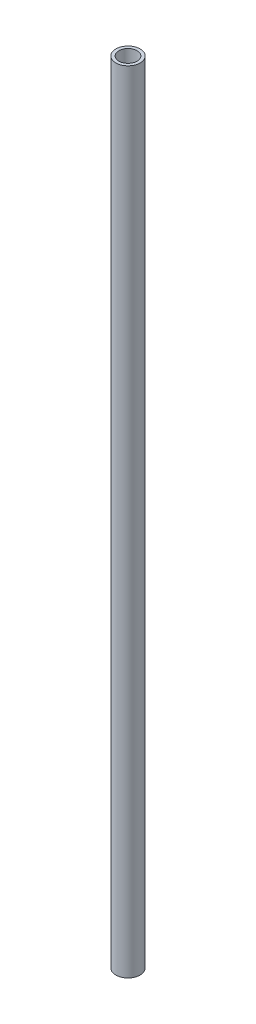
ISO-10303-21;
HEADER;
FILE_DESCRIPTION(('STEP AP214'),'2;1');
FILE_NAME('part.step','',(''),(''),'','','');
FILE_SCHEMA(('AUTOMOTIVE_DESIGN { 1 0 10303 214 1 1 1 1 }'));
ENDSEC;
DATA;
#1=APPLICATION_CONTEXT('core data for automotive mechanical design processes');
#2=APPLICATION_PROTOCOL_DEFINITION('international standard','automotive_design',2000,#1);
#3=PRODUCT_CONTEXT('',#1,'mechanical');
#4=PRODUCT('Part','Part','',(#3));
#5=PRODUCT_RELATED_PRODUCT_CATEGORY('part','',(#4));
#6=PRODUCT_DEFINITION_FORMATION('','',#4);
#7=PRODUCT_DEFINITION_CONTEXT('part definition',#1,'design');
#8=PRODUCT_DEFINITION('design','',#6,#7);
#9=PRODUCT_DEFINITION_SHAPE('','',#8);
#10=(LENGTH_UNIT() NAMED_UNIT(*) SI_UNIT(.MILLI.,.METRE.));
#11=(NAMED_UNIT(*) PLANE_ANGLE_UNIT() SI_UNIT($,.RADIAN.));
#12=(NAMED_UNIT(*) SI_UNIT($,.STERADIAN.) SOLID_ANGLE_UNIT());
#13=UNCERTAINTY_MEASURE_WITH_UNIT(LENGTH_MEASURE(1.E-05),#10,'distance_accuracy_value','');
#14=(GEOMETRIC_REPRESENTATION_CONTEXT(3) GLOBAL_UNCERTAINTY_ASSIGNED_CONTEXT((#13)) GLOBAL_UNIT_ASSIGNED_CONTEXT((#10,
#11,#12)) REPRESENTATION_CONTEXT('',''));
#15=CARTESIAN_POINT('',(0.,0.,0.));
#16=DIRECTION('',(0.,0.,1.));
#17=DIRECTION('',(1.,0.,0.));
#18=AXIS2_PLACEMENT_3D('',#15,#16,#17);
#19=CARTESIAN_POINT('',(0.,130.,0.));
#20=DIRECTION('',(0.,1.,0.));
#21=DIRECTION('',(0.,0.,1.));
#22=AXIS2_PLACEMENT_3D('',#19,#20,#21);
#23=PLANE('',#22);
#24=CARTESIAN_POINT('',(0.,130.,0.));
#25=DIRECTION('',(0.,1.,0.));
#26=DIRECTION('',(0.,0.,1.));
#27=AXIS2_PLACEMENT_3D('',#24,#25,#26);
#28=CIRCLE('',#27,4.);
#29=CARTESIAN_POINT('',(0.,130.,4.));
#30=VERTEX_POINT('',#29);
#31=EDGE_CURVE('E10',#30,#30,#28,.T.);
#32=ORIENTED_EDGE('',*,*,#31,.T.);
#33=EDGE_LOOP('',(#32));
#34=FACE_BOUND('',#33,.T.);
#35=CARTESIAN_POINT('',(0.,130.,0.));
#36=DIRECTION('',(0.,1.,0.));
#37=DIRECTION('',(0.,0.,1.));
#38=AXIS2_PLACEMENT_3D('',#35,#36,#37);
#39=CIRCLE('',#38,3.);
#40=CARTESIAN_POINT('',(0.,130.,3.));
#41=VERTEX_POINT('',#40);
#42=EDGE_CURVE('E48',#41,#41,#39,.T.);
#43=ORIENTED_EDGE('',*,*,#42,.F.);
#44=EDGE_LOOP('',(#43));
#45=FACE_BOUND('',#44,.T.);
#46=ADVANCED_FACE('F37',(#34,#45),#23,.T.);
#47=CARTESIAN_POINT('',(0.,-130.,0.));
#48=DIRECTION('',(0.,1.,0.));
#49=DIRECTION('',(0.,0.,1.));
#50=AXIS2_PLACEMENT_3D('',#47,#48,#49);
#51=PLANE('',#50);
#52=CARTESIAN_POINT('',(0.,-130.,0.));
#53=DIRECTION('',(0.,1.,0.));
#54=DIRECTION('',(0.,0.,1.));
#55=AXIS2_PLACEMENT_3D('',#52,#53,#54);
#56=CIRCLE('',#55,4.);
#57=CARTESIAN_POINT('',(0.,-130.,4.));
#58=VERTEX_POINT('',#57);
#59=EDGE_CURVE('E41',#58,#58,#56,.T.);
#60=ORIENTED_EDGE('',*,*,#59,.F.);
#61=EDGE_LOOP('',(#60));
#62=FACE_BOUND('',#61,.T.);
#63=CARTESIAN_POINT('',(0.,-130.,0.));
#64=DIRECTION('',(0.,1.,0.));
#65=DIRECTION('',(0.,0.,1.));
#66=AXIS2_PLACEMENT_3D('',#63,#64,#65);
#67=CIRCLE('',#66,3.);
#68=CARTESIAN_POINT('',(0.,-130.,3.));
#69=VERTEX_POINT('',#68);
#70=EDGE_CURVE('E50',#69,#69,#67,.T.);
#71=ORIENTED_EDGE('',*,*,#70,.T.);
#72=EDGE_LOOP('',(#71));
#73=FACE_BOUND('',#72,.T.);
#74=ADVANCED_FACE('F60',(#62,#73),#51,.F.);
#75=CARTESIAN_POINT('',(0.,130.,0.));
#76=DIRECTION('',(0.,-1.,0.));
#77=DIRECTION('',(0.,0.,-1.));
#78=AXIS2_PLACEMENT_3D('',#75,#76,#77);
#79=CYLINDRICAL_SURFACE('',#78,4.);
#80=ORIENTED_EDGE('',*,*,#31,.F.);
#81=EDGE_LOOP('',(#80));
#82=FACE_BOUND('',#81,.T.);
#83=ORIENTED_EDGE('',*,*,#59,.T.);
#84=EDGE_LOOP('',(#83));
#85=FACE_BOUND('',#84,.T.);
#86=ADVANCED_FACE('F39',(#82,#85),#79,.T.);
#87=CARTESIAN_POINT('',(0.,130.,0.));
#88=DIRECTION('',(0.,-1.,0.));
#89=DIRECTION('',(0.,0.,-1.));
#90=AXIS2_PLACEMENT_3D('',#87,#88,#89);
#91=CYLINDRICAL_SURFACE('',#90,3.);
#92=ORIENTED_EDGE('',*,*,#42,.T.);
#93=EDGE_LOOP('',(#92));
#94=FACE_BOUND('',#93,.T.);
#95=ORIENTED_EDGE('',*,*,#70,.F.);
#96=EDGE_LOOP('',(#95));
#97=FACE_BOUND('',#96,.T.);
#98=ADVANCED_FACE('F56',(#94,#97),#91,.F.);
#99=CLOSED_SHELL('',(#46,#74,#86,#98));
#100=MANIFOLD_SOLID_BREP('B2',#99);
#101=ADVANCED_BREP_SHAPE_REPRESENTATION('',(#18,#100),#14);
#102=SHAPE_DEFINITION_REPRESENTATION(#9,#101);
ENDSEC;
END-ISO-10303-21;
